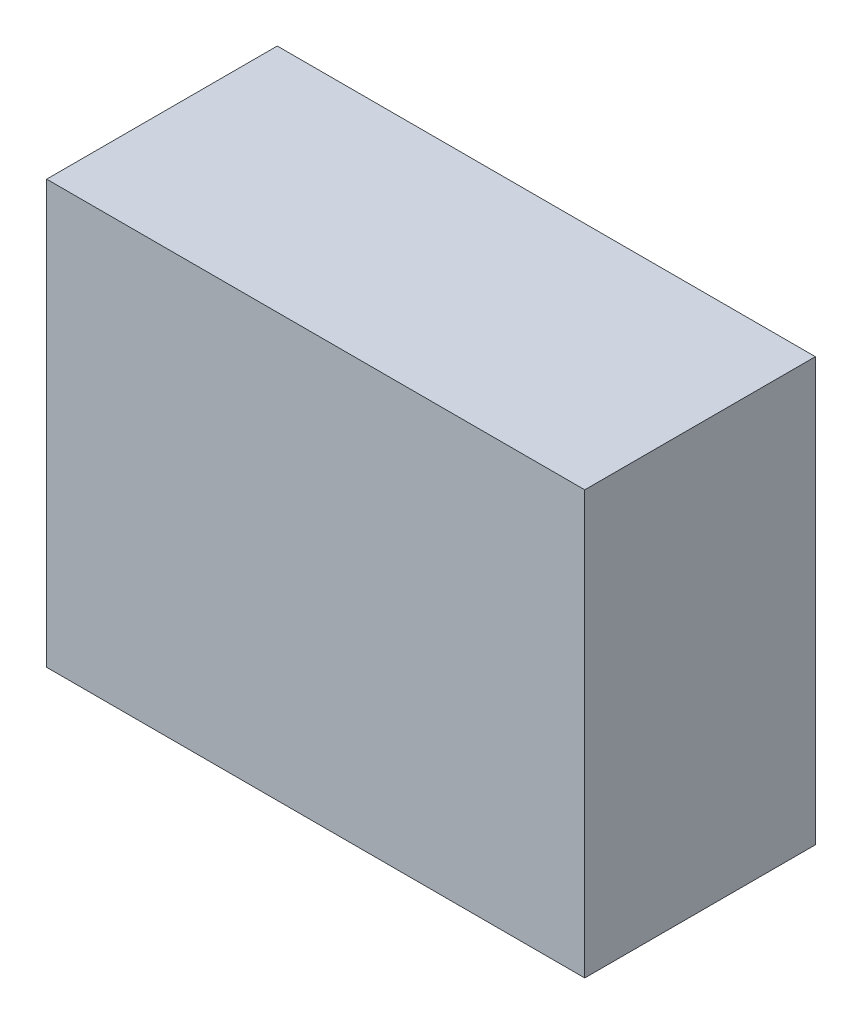
ISO-10303-21;
HEADER;
FILE_DESCRIPTION(('STEP AP214'),'2;1');
FILE_NAME('part.step','',(''),(''),'','','');
FILE_SCHEMA(('AUTOMOTIVE_DESIGN { 1 0 10303 214 1 1 1 1 }'));
ENDSEC;
DATA;
#1=APPLICATION_CONTEXT('core data for automotive mechanical design processes');
#2=APPLICATION_PROTOCOL_DEFINITION('international standard','automotive_design',2000,#1);
#3=PRODUCT_CONTEXT('',#1,'mechanical');
#4=PRODUCT('Part','Part','',(#3));
#5=PRODUCT_RELATED_PRODUCT_CATEGORY('part','',(#4));
#6=PRODUCT_DEFINITION_FORMATION('','',#4);
#7=PRODUCT_DEFINITION_CONTEXT('part definition',#1,'design');
#8=PRODUCT_DEFINITION('design','',#6,#7);
#9=PRODUCT_DEFINITION_SHAPE('','',#8);
#10=(LENGTH_UNIT() NAMED_UNIT(*) SI_UNIT(.MILLI.,.METRE.));
#11=(NAMED_UNIT(*) PLANE_ANGLE_UNIT() SI_UNIT($,.RADIAN.));
#12=(NAMED_UNIT(*) SI_UNIT($,.STERADIAN.) SOLID_ANGLE_UNIT());
#13=UNCERTAINTY_MEASURE_WITH_UNIT(LENGTH_MEASURE(1.E-05),#10,'distance_accuracy_value','');
#14=(GEOMETRIC_REPRESENTATION_CONTEXT(3) GLOBAL_UNCERTAINTY_ASSIGNED_CONTEXT((#13)) GLOBAL_UNIT_ASSIGNED_CONTEXT((#10,
#11,#12)) REPRESENTATION_CONTEXT('',''));
#15=CARTESIAN_POINT('',(0.,0.,0.));
#16=DIRECTION('',(0.,0.,1.));
#17=DIRECTION('',(1.,0.,0.));
#18=AXIS2_PLACEMENT_3D('',#15,#16,#17);
#19=CARTESIAN_POINT('',(-45.8491525423729,139.7,-33.7411016949153));
#20=DIRECTION('',(1.,0.,0.));
#21=DIRECTION('',(0.,0.,-1.));
#22=AXIS2_PLACEMENT_3D('',#19,#20,#21);
#23=PLANE('',#22);
#24=DIRECTION('',(0.,0.,1.));
#25=VECTOR('',#24,1.);
#26=CARTESIAN_POINT('',(-45.8491525423729,0.,-33.7411016949153));
#27=LINE('',#26,#25);
#28=CARTESIAN_POINT('',(-45.8491525423729,0.,-33.7411016949153));
#29=VERTEX_POINT('',#28);
#30=CARTESIAN_POINT('',(-45.8491525423729,0.,42.4588983050847));
#31=VERTEX_POINT('',#30);
#32=EDGE_CURVE('E97',#29,#31,#27,.T.);
#33=ORIENTED_EDGE('',*,*,#32,.T.);
#34=DIRECTION('',(0.,-1.,0.));
#35=VECTOR('',#34,1.);
#36=CARTESIAN_POINT('',(-45.8491525423729,139.7,42.4588983050847));
#37=LINE('',#36,#35);
#38=CARTESIAN_POINT('',(-45.8491525423729,139.7,42.4588983050847));
#39=VERTEX_POINT('',#38);
#40=EDGE_CURVE('E11',#39,#31,#37,.T.);
#41=ORIENTED_EDGE('',*,*,#40,.F.);
#42=DIRECTION('',(0.,0.,1.));
#43=VECTOR('',#42,1.);
#44=CARTESIAN_POINT('',(-45.8491525423729,139.7,-33.7411016949153));
#45=LINE('',#44,#43);
#46=CARTESIAN_POINT('',(-45.8491525423729,139.7,-33.7411016949153));
#47=VERTEX_POINT('',#46);
#48=EDGE_CURVE('E85',#47,#39,#45,.T.);
#49=ORIENTED_EDGE('',*,*,#48,.F.);
#50=DIRECTION('',(0.,-1.,0.));
#51=VECTOR('',#50,1.);
#52=CARTESIAN_POINT('',(-45.8491525423729,139.7,-33.7411016949153));
#53=LINE('',#52,#51);
#54=EDGE_CURVE('E93',#47,#29,#53,.T.);
#55=ORIENTED_EDGE('',*,*,#54,.T.);
#56=EDGE_LOOP('',(#33,#41,#49,#55));
#57=FACE_BOUND('',#56,.T.);
#58=ADVANCED_FACE('F34',(#57),#23,.F.);
#59=CARTESIAN_POINT('',(-45.8491525423729,139.7,42.4588983050847));
#60=DIRECTION('',(0.,0.,-1.));
#61=DIRECTION('',(-1.,0.,0.));
#62=AXIS2_PLACEMENT_3D('',#59,#60,#61);
#63=PLANE('',#62);
#64=DIRECTION('',(1.,0.,0.));
#65=VECTOR('',#64,1.);
#66=CARTESIAN_POINT('',(-45.8491525423729,0.,42.4588983050847));
#67=LINE('',#66,#65);
#68=CARTESIAN_POINT('',(131.950847457627,0.,42.4588983050847));
#69=VERTEX_POINT('',#68);
#70=EDGE_CURVE('E89',#31,#69,#67,.T.);
#71=ORIENTED_EDGE('',*,*,#70,.T.);
#72=DIRECTION('',(0.,-1.,0.));
#73=VECTOR('',#72,1.);
#74=CARTESIAN_POINT('',(131.950847457627,139.7,42.4588983050847));
#75=LINE('',#74,#73);
#76=CARTESIAN_POINT('',(131.950847457627,139.7,42.4588983050847));
#77=VERTEX_POINT('',#76);
#78=EDGE_CURVE('E42',#77,#69,#75,.T.);
#79=ORIENTED_EDGE('',*,*,#78,.F.);
#80=DIRECTION('',(1.,0.,0.));
#81=VECTOR('',#80,1.);
#82=CARTESIAN_POINT('',(-45.8491525423729,139.7,42.4588983050847));
#83=LINE('',#82,#81);
#84=EDGE_CURVE('E80',#39,#77,#83,.T.);
#85=ORIENTED_EDGE('',*,*,#84,.F.);
#86=ORIENTED_EDGE('',*,*,#40,.T.);
#87=EDGE_LOOP('',(#71,#79,#85,#86));
#88=FACE_BOUND('',#87,.T.);
#89=ADVANCED_FACE('F88',(#88),#63,.F.);
#90=CARTESIAN_POINT('',(131.950847457627,139.7,-33.7411016949153));
#91=DIRECTION('',(-1.,0.,0.));
#92=DIRECTION('',(0.,0.,1.));
#93=AXIS2_PLACEMENT_3D('',#90,#91,#92);
#94=PLANE('',#93);
#95=DIRECTION('',(0.,0.,-1.));
#96=VECTOR('',#95,1.);
#97=CARTESIAN_POINT('',(131.950847457627,0.,-33.7411016949153));
#98=LINE('',#97,#96);
#99=CARTESIAN_POINT('',(131.950847457627,0.,-33.7411016949153));
#100=VERTEX_POINT('',#99);
#101=EDGE_CURVE('E67',#69,#100,#98,.T.);
#102=ORIENTED_EDGE('',*,*,#101,.T.);
#103=DIRECTION('',(0.,-1.,0.));
#104=VECTOR('',#103,1.);
#105=CARTESIAN_POINT('',(131.950847457627,139.7,-33.7411016949153));
#106=LINE('',#105,#104);
#107=CARTESIAN_POINT('',(131.950847457627,139.7,-33.7411016949153));
#108=VERTEX_POINT('',#107);
#109=EDGE_CURVE('E90',#108,#100,#106,.T.);
#110=ORIENTED_EDGE('',*,*,#109,.F.);
#111=DIRECTION('',(0.,0.,-1.));
#112=VECTOR('',#111,1.);
#113=CARTESIAN_POINT('',(131.950847457627,139.7,-33.7411016949153));
#114=LINE('',#113,#112);
#115=EDGE_CURVE('E83',#77,#108,#114,.T.);
#116=ORIENTED_EDGE('',*,*,#115,.F.);
#117=ORIENTED_EDGE('',*,*,#78,.T.);
#118=EDGE_LOOP('',(#102,#110,#116,#117));
#119=FACE_BOUND('',#118,.T.);
#120=ADVANCED_FACE('F91',(#119),#94,.F.);
#121=CARTESIAN_POINT('',(-45.8491525423729,139.7,-33.7411016949153));
#122=DIRECTION('',(0.,0.,1.));
#123=DIRECTION('',(1.,0.,0.));
#124=AXIS2_PLACEMENT_3D('',#121,#122,#123);
#125=PLANE('',#124);
#126=DIRECTION('',(-1.,0.,0.));
#127=VECTOR('',#126,1.);
#128=CARTESIAN_POINT('',(-45.8491525423729,0.,-33.7411016949153));
#129=LINE('',#128,#127);
#130=EDGE_CURVE('E73',#100,#29,#129,.T.);
#131=ORIENTED_EDGE('',*,*,#130,.T.);
#132=ORIENTED_EDGE('',*,*,#54,.F.);
#133=DIRECTION('',(-1.,0.,0.));
#134=VECTOR('',#133,1.);
#135=CARTESIAN_POINT('',(-45.8491525423729,139.7,-33.7411016949153));
#136=LINE('',#135,#134);
#137=EDGE_CURVE('E50',#108,#47,#136,.T.);
#138=ORIENTED_EDGE('',*,*,#137,.F.);
#139=ORIENTED_EDGE('',*,*,#109,.T.);
#140=EDGE_LOOP('',(#131,#132,#138,#139));
#141=FACE_BOUND('',#140,.T.);
#142=ADVANCED_FACE('F104',(#141),#125,.F.);
#143=CARTESIAN_POINT('',(0.,139.7,0.));
#144=DIRECTION('',(0.,1.,0.));
#145=DIRECTION('',(0.,0.,1.));
#146=AXIS2_PLACEMENT_3D('',#143,#144,#145);
#147=PLANE('',#146);
#148=ORIENTED_EDGE('',*,*,#48,.T.);
#149=ORIENTED_EDGE('',*,*,#84,.T.);
#150=ORIENTED_EDGE('',*,*,#115,.T.);
#151=ORIENTED_EDGE('',*,*,#137,.T.);
#152=EDGE_LOOP('',(#148,#149,#150,#151));
#153=FACE_BOUND('',#152,.T.);
#154=ADVANCED_FACE('F81',(#153),#147,.T.);
#155=CARTESIAN_POINT('',(0.,0.,0.));
#156=DIRECTION('',(0.,1.,0.));
#157=DIRECTION('',(0.,0.,1.));
#158=AXIS2_PLACEMENT_3D('',#155,#156,#157);
#159=PLANE('',#158);
#160=ORIENTED_EDGE('',*,*,#32,.F.);
#161=ORIENTED_EDGE('',*,*,#130,.F.);
#162=ORIENTED_EDGE('',*,*,#101,.F.);
#163=ORIENTED_EDGE('',*,*,#70,.F.);
#164=EDGE_LOOP('',(#160,#161,#162,#163));
#165=FACE_BOUND('',#164,.T.);
#166=ADVANCED_FACE('F107',(#165),#159,.F.);
#167=CLOSED_SHELL('',(#58,#89,#120,#142,#154,#166));
#168=MANIFOLD_SOLID_BREP('B2',#167);
#169=ADVANCED_BREP_SHAPE_REPRESENTATION('',(#18,#168),#14);
#170=SHAPE_DEFINITION_REPRESENTATION(#9,#169);
ENDSEC;
END-ISO-10303-21;
